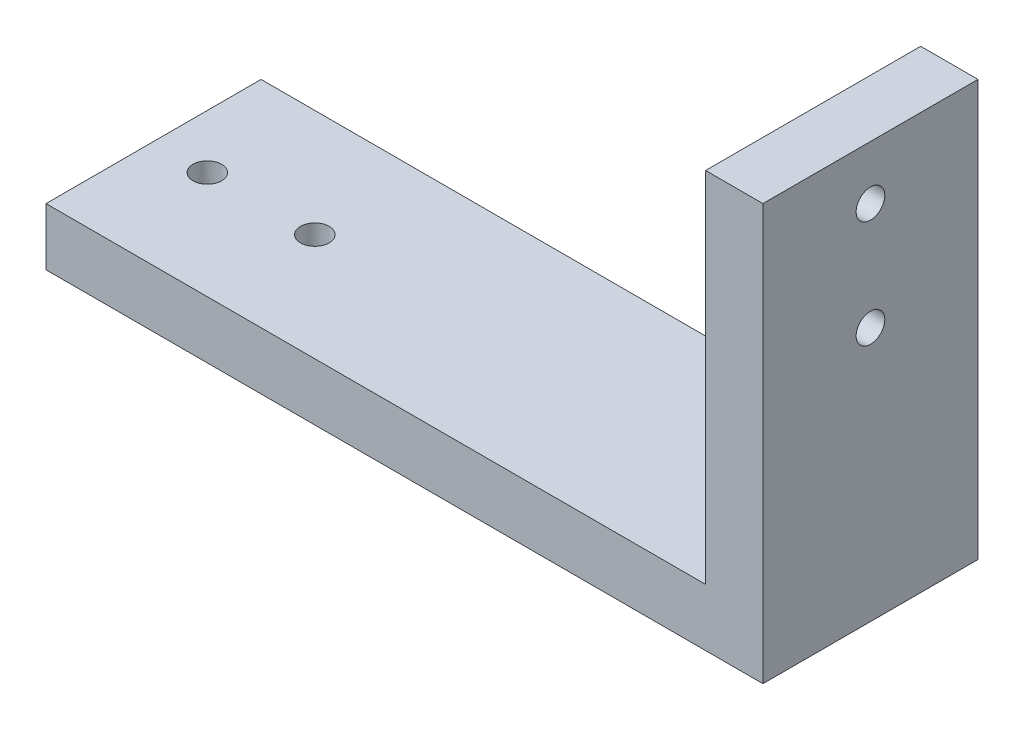
ISO-10303-21;
HEADER;
FILE_DESCRIPTION(('STEP AP214'),'2;1');
FILE_NAME('part.step','',(''),(''),'','','');
FILE_SCHEMA(('AUTOMOTIVE_DESIGN { 1 0 10303 214 1 1 1 1 }'));
ENDSEC;
DATA;
#1=APPLICATION_CONTEXT('core data for automotive mechanical design processes');
#2=APPLICATION_PROTOCOL_DEFINITION('international standard','automotive_design',2000,#1);
#3=PRODUCT_CONTEXT('',#1,'mechanical');
#4=PRODUCT('Part','Part','',(#3));
#5=PRODUCT_RELATED_PRODUCT_CATEGORY('part','',(#4));
#6=PRODUCT_DEFINITION_FORMATION('','',#4);
#7=PRODUCT_DEFINITION_CONTEXT('part definition',#1,'design');
#8=PRODUCT_DEFINITION('design','',#6,#7);
#9=PRODUCT_DEFINITION_SHAPE('','',#8);
#10=(LENGTH_UNIT() NAMED_UNIT(*) SI_UNIT(.MILLI.,.METRE.));
#11=(NAMED_UNIT(*) PLANE_ANGLE_UNIT() SI_UNIT($,.RADIAN.));
#12=(NAMED_UNIT(*) SI_UNIT($,.STERADIAN.) SOLID_ANGLE_UNIT());
#13=UNCERTAINTY_MEASURE_WITH_UNIT(LENGTH_MEASURE(1.E-05),#10,'distance_accuracy_value','');
#14=(GEOMETRIC_REPRESENTATION_CONTEXT(3) GLOBAL_UNCERTAINTY_ASSIGNED_CONTEXT((#13)) GLOBAL_UNIT_ASSIGNED_CONTEXT((#10,
#11,#12)) REPRESENTATION_CONTEXT('',''));
#15=CARTESIAN_POINT('',(0.,0.,0.));
#16=DIRECTION('',(0.,0.,1.));
#17=DIRECTION('',(1.,0.,0.));
#18=AXIS2_PLACEMENT_3D('',#15,#16,#17);
#19=CARTESIAN_POINT('',(0.,8.,0.));
#20=DIRECTION('',(0.,1.,0.));
#21=DIRECTION('',(0.,0.,1.));
#22=AXIS2_PLACEMENT_3D('',#19,#20,#21);
#23=PLANE('',#22);
#24=DIRECTION('',(0.,0.,1.));
#25=VECTOR('',#24,1.);
#26=CARTESIAN_POINT('',(42.,8.,-15.));
#27=LINE('',#26,#25);
#28=CARTESIAN_POINT('',(42.,8.,-15.));
#29=VERTEX_POINT('',#28);
#30=CARTESIAN_POINT('',(42.,8.,15.));
#31=VERTEX_POINT('',#30);
#32=EDGE_CURVE('E50',#29,#31,#27,.T.);
#33=ORIENTED_EDGE('',*,*,#32,.F.);
#34=DIRECTION('',(-1.,0.,0.));
#35=VECTOR('',#34,1.);
#36=CARTESIAN_POINT('',(-50.,8.,-15.));
#37=LINE('',#36,#35);
#38=CARTESIAN_POINT('',(-50.,8.,-15.));
#39=VERTEX_POINT('',#38);
#40=EDGE_CURVE('E87',#29,#39,#37,.T.);
#41=ORIENTED_EDGE('',*,*,#40,.T.);
#42=DIRECTION('',(0.,0.,1.));
#43=VECTOR('',#42,1.);
#44=CARTESIAN_POINT('',(-50.,8.,-15.));
#45=LINE('',#44,#43);
#46=CARTESIAN_POINT('',(-50.,8.,15.));
#47=VERTEX_POINT('',#46);
#48=EDGE_CURVE('E56',#39,#47,#45,.T.);
#49=ORIENTED_EDGE('',*,*,#48,.T.);
#50=DIRECTION('',(1.,0.,0.));
#51=VECTOR('',#50,1.);
#52=CARTESIAN_POINT('',(-50.,8.,15.));
#53=LINE('',#52,#51);
#54=EDGE_CURVE('E97',#47,#31,#53,.T.);
#55=ORIENTED_EDGE('',*,*,#54,.T.);
#56=EDGE_LOOP('',(#33,#41,#49,#55));
#57=FACE_BOUND('',#56,.T.);
#58=CARTESIAN_POINT('',(-42.5,8.,0.));
#59=DIRECTION('',(0.,1.,0.));
#60=DIRECTION('',(0.,0.,1.));
#61=AXIS2_PLACEMENT_3D('',#58,#59,#60);
#62=CIRCLE('',#61,2.);
#63=CARTESIAN_POINT('',(-42.5,8.,2.));
#64=VERTEX_POINT('',#63);
#65=EDGE_CURVE('E102',#64,#64,#62,.T.);
#66=ORIENTED_EDGE('',*,*,#65,.F.);
#67=EDGE_LOOP('',(#66));
#68=FACE_BOUND('',#67,.T.);
#69=CARTESIAN_POINT('',(-27.5,8.,0.));
#70=DIRECTION('',(0.,1.,0.));
#71=DIRECTION('',(0.,0.,1.));
#72=AXIS2_PLACEMENT_3D('',#69,#70,#71);
#73=CIRCLE('',#72,2.);
#74=CARTESIAN_POINT('',(-27.5,8.,2.));
#75=VERTEX_POINT('',#74);
#76=EDGE_CURVE('E145',#75,#75,#73,.T.);
#77=ORIENTED_EDGE('',*,*,#76,.F.);
#78=EDGE_LOOP('',(#77));
#79=FACE_BOUND('',#78,.T.);
#80=ADVANCED_FACE('F33',(#57,#68,#79),#23,.T.);
#81=CARTESIAN_POINT('',(0.,0.,0.));
#82=DIRECTION('',(0.,1.,0.));
#83=DIRECTION('',(0.,0.,1.));
#84=AXIS2_PLACEMENT_3D('',#81,#82,#83);
#85=PLANE('',#84);
#86=DIRECTION('',(0.,0.,-1.));
#87=VECTOR('',#86,1.);
#88=CARTESIAN_POINT('',(50.,0.,-15.));
#89=LINE('',#88,#87);
#90=CARTESIAN_POINT('',(50.,0.,15.));
#91=VERTEX_POINT('',#90);
#92=CARTESIAN_POINT('',(50.,0.,-15.));
#93=VERTEX_POINT('',#92);
#94=EDGE_CURVE('E94',#91,#93,#89,.T.);
#95=ORIENTED_EDGE('',*,*,#94,.F.);
#96=DIRECTION('',(1.,0.,0.));
#97=VECTOR('',#96,1.);
#98=CARTESIAN_POINT('',(-50.,0.,15.));
#99=LINE('',#98,#97);
#100=CARTESIAN_POINT('',(-50.,0.,15.));
#101=VERTEX_POINT('',#100);
#102=EDGE_CURVE('E76',#101,#91,#99,.T.);
#103=ORIENTED_EDGE('',*,*,#102,.F.);
#104=DIRECTION('',(0.,0.,1.));
#105=VECTOR('',#104,1.);
#106=CARTESIAN_POINT('',(-50.,0.,-15.));
#107=LINE('',#106,#105);
#108=CARTESIAN_POINT('',(-50.,0.,-15.));
#109=VERTEX_POINT('',#108);
#110=EDGE_CURVE('E88',#109,#101,#107,.T.);
#111=ORIENTED_EDGE('',*,*,#110,.F.);
#112=DIRECTION('',(-1.,0.,0.));
#113=VECTOR('',#112,1.);
#114=CARTESIAN_POINT('',(-50.,0.,-15.));
#115=LINE('',#114,#113);
#116=EDGE_CURVE('E101',#93,#109,#115,.T.);
#117=ORIENTED_EDGE('',*,*,#116,.F.);
#118=EDGE_LOOP('',(#95,#103,#111,#117));
#119=FACE_BOUND('',#118,.T.);
#120=CARTESIAN_POINT('',(-42.5,0.,0.));
#121=DIRECTION('',(0.,1.,0.));
#122=DIRECTION('',(0.,0.,1.));
#123=AXIS2_PLACEMENT_3D('',#120,#121,#122);
#124=CIRCLE('',#123,2.);
#125=CARTESIAN_POINT('',(-42.5,0.,2.));
#126=VERTEX_POINT('',#125);
#127=EDGE_CURVE('E106',#126,#126,#124,.T.);
#128=ORIENTED_EDGE('',*,*,#127,.T.);
#129=EDGE_LOOP('',(#128));
#130=FACE_BOUND('',#129,.T.);
#131=CARTESIAN_POINT('',(-27.5,0.,0.));
#132=DIRECTION('',(0.,1.,0.));
#133=DIRECTION('',(0.,0.,1.));
#134=AXIS2_PLACEMENT_3D('',#131,#132,#133);
#135=CIRCLE('',#134,2.);
#136=CARTESIAN_POINT('',(-27.5,0.,2.));
#137=VERTEX_POINT('',#136);
#138=EDGE_CURVE('E144',#137,#137,#135,.T.);
#139=ORIENTED_EDGE('',*,*,#138,.T.);
#140=EDGE_LOOP('',(#139));
#141=FACE_BOUND('',#140,.T.);
#142=ADVANCED_FACE('F99',(#119,#130,#141),#85,.F.);
#143=CARTESIAN_POINT('',(50.,8.,-15.));
#144=DIRECTION('',(-1.,0.,0.));
#145=DIRECTION('',(0.,0.,1.));
#146=AXIS2_PLACEMENT_3D('',#143,#144,#145);
#147=PLANE('',#146);
#148=CARTESIAN_POINT('',(50.,50.5,0.));
#149=DIRECTION('',(1.,0.,0.));
#150=DIRECTION('',(0.,0.,-1.));
#151=AXIS2_PLACEMENT_3D('',#148,#149,#150);
#152=CIRCLE('',#151,2.);
#153=CARTESIAN_POINT('',(50.,50.5,-2.));
#154=VERTEX_POINT('',#153);
#155=EDGE_CURVE('E116',#154,#154,#152,.T.);
#156=ORIENTED_EDGE('',*,*,#155,.F.);
#157=EDGE_LOOP('',(#156));
#158=FACE_BOUND('',#157,.T.);
#159=CARTESIAN_POINT('',(50.,35.5,0.));
#160=DIRECTION('',(1.,0.,0.));
#161=DIRECTION('',(0.,0.,-1.));
#162=AXIS2_PLACEMENT_3D('',#159,#160,#161);
#163=CIRCLE('',#162,2.);
#164=CARTESIAN_POINT('',(50.,35.5,-2.));
#165=VERTEX_POINT('',#164);
#166=EDGE_CURVE('E121',#165,#165,#163,.T.);
#167=ORIENTED_EDGE('',*,*,#166,.F.);
#168=EDGE_LOOP('',(#167));
#169=FACE_BOUND('',#168,.T.);
#170=ORIENTED_EDGE('',*,*,#94,.T.);
#171=DIRECTION('',(0.,-1.,0.));
#172=VECTOR('',#171,1.);
#173=CARTESIAN_POINT('',(50.,8.,-15.));
#174=LINE('',#173,#172);
#175=CARTESIAN_POINT('',(50.,58.,-15.));
#176=VERTEX_POINT('',#175);
#177=EDGE_CURVE('E11',#176,#93,#174,.T.);
#178=ORIENTED_EDGE('',*,*,#177,.F.);
#179=DIRECTION('',(0.,0.,-1.));
#180=VECTOR('',#179,1.);
#181=CARTESIAN_POINT('',(50.,58.,-15.));
#182=LINE('',#181,#180);
#183=CARTESIAN_POINT('',(50.,58.,15.));
#184=VERTEX_POINT('',#183);
#185=EDGE_CURVE('E96',#184,#176,#182,.T.);
#186=ORIENTED_EDGE('',*,*,#185,.F.);
#187=DIRECTION('',(0.,-1.,0.));
#188=VECTOR('',#187,1.);
#189=CARTESIAN_POINT('',(50.,8.,15.));
#190=LINE('',#189,#188);
#191=EDGE_CURVE('E80',#184,#91,#190,.T.);
#192=ORIENTED_EDGE('',*,*,#191,.T.);
#193=EDGE_LOOP('',(#170,#178,#186,#192));
#194=FACE_BOUND('',#193,.T.);
#195=ADVANCED_FACE('F35',(#158,#169,#194),#147,.F.);
#196=CARTESIAN_POINT('',(-50.,8.,-15.));
#197=DIRECTION('',(0.,0.,1.));
#198=DIRECTION('',(1.,0.,0.));
#199=AXIS2_PLACEMENT_3D('',#196,#197,#198);
#200=PLANE('',#199);
#201=ORIENTED_EDGE('',*,*,#116,.T.);
#202=DIRECTION('',(0.,-1.,0.));
#203=VECTOR('',#202,1.);
#204=CARTESIAN_POINT('',(-50.,8.,-15.));
#205=LINE('',#204,#203);
#206=EDGE_CURVE('E42',#39,#109,#205,.T.);
#207=ORIENTED_EDGE('',*,*,#206,.F.);
#208=ORIENTED_EDGE('',*,*,#40,.F.);
#209=DIRECTION('',(0.,-1.,0.));
#210=VECTOR('',#209,1.);
#211=CARTESIAN_POINT('',(42.,58.,-15.));
#212=LINE('',#211,#210);
#213=CARTESIAN_POINT('',(42.,58.,-15.));
#214=VERTEX_POINT('',#213);
#215=EDGE_CURVE('E141',#214,#29,#212,.T.);
#216=ORIENTED_EDGE('',*,*,#215,.F.);
#217=DIRECTION('',(-1.,0.,0.));
#218=VECTOR('',#217,1.);
#219=CARTESIAN_POINT('',(50.,58.,-15.));
#220=LINE('',#219,#218);
#221=EDGE_CURVE('E129',#176,#214,#220,.T.);
#222=ORIENTED_EDGE('',*,*,#221,.F.);
#223=ORIENTED_EDGE('',*,*,#177,.T.);
#224=EDGE_LOOP('',(#201,#207,#208,#216,#222,#223));
#225=FACE_BOUND('',#224,.T.);
#226=ADVANCED_FACE('F170',(#225),#200,.F.);
#227=CARTESIAN_POINT('',(-50.,8.,-15.));
#228=DIRECTION('',(1.,0.,0.));
#229=DIRECTION('',(0.,0.,-1.));
#230=AXIS2_PLACEMENT_3D('',#227,#228,#229);
#231=PLANE('',#230);
#232=ORIENTED_EDGE('',*,*,#110,.T.);
#233=DIRECTION('',(0.,-1.,0.));
#234=VECTOR('',#233,1.);
#235=CARTESIAN_POINT('',(-50.,8.,15.));
#236=LINE('',#235,#234);
#237=EDGE_CURVE('E83',#47,#101,#236,.T.);
#238=ORIENTED_EDGE('',*,*,#237,.F.);
#239=ORIENTED_EDGE('',*,*,#48,.F.);
#240=ORIENTED_EDGE('',*,*,#206,.T.);
#241=EDGE_LOOP('',(#232,#238,#239,#240));
#242=FACE_BOUND('',#241,.T.);
#243=ADVANCED_FACE('F173',(#242),#231,.F.);
#244=CARTESIAN_POINT('',(-50.,8.,15.));
#245=DIRECTION('',(0.,0.,-1.));
#246=DIRECTION('',(-1.,0.,0.));
#247=AXIS2_PLACEMENT_3D('',#244,#245,#246);
#248=PLANE('',#247);
#249=ORIENTED_EDGE('',*,*,#102,.T.);
#250=ORIENTED_EDGE('',*,*,#191,.F.);
#251=DIRECTION('',(1.,0.,0.));
#252=VECTOR('',#251,1.);
#253=CARTESIAN_POINT('',(50.,58.,15.));
#254=LINE('',#253,#252);
#255=CARTESIAN_POINT('',(42.,58.,15.));
#256=VERTEX_POINT('',#255);
#257=EDGE_CURVE('E135',#256,#184,#254,.T.);
#258=ORIENTED_EDGE('',*,*,#257,.F.);
#259=DIRECTION('',(0.,-1.,0.));
#260=VECTOR('',#259,1.);
#261=CARTESIAN_POINT('',(42.,58.,15.));
#262=LINE('',#261,#260);
#263=EDGE_CURVE('E137',#256,#31,#262,.T.);
#264=ORIENTED_EDGE('',*,*,#263,.T.);
#265=ORIENTED_EDGE('',*,*,#54,.F.);
#266=ORIENTED_EDGE('',*,*,#237,.T.);
#267=EDGE_LOOP('',(#249,#250,#258,#264,#265,#266));
#268=FACE_BOUND('',#267,.T.);
#269=ADVANCED_FACE('F78',(#268),#248,.F.);
#270=CARTESIAN_POINT('',(-42.5,8.,0.));
#271=DIRECTION('',(0.,-1.,0.));
#272=DIRECTION('',(0.,0.,-1.));
#273=AXIS2_PLACEMENT_3D('',#270,#271,#272);
#274=CYLINDRICAL_SURFACE('',#273,2.);
#275=ORIENTED_EDGE('',*,*,#65,.T.);
#276=EDGE_LOOP('',(#275));
#277=FACE_BOUND('',#276,.T.);
#278=ORIENTED_EDGE('',*,*,#127,.F.);
#279=EDGE_LOOP('',(#278));
#280=FACE_BOUND('',#279,.T.);
#281=ADVANCED_FACE('F180',(#277,#280),#274,.F.);
#282=CARTESIAN_POINT('',(-27.5,8.,0.));
#283=DIRECTION('',(0.,-1.,0.));
#284=DIRECTION('',(0.,0.,-1.));
#285=AXIS2_PLACEMENT_3D('',#282,#283,#284);
#286=CYLINDRICAL_SURFACE('',#285,2.);
#287=ORIENTED_EDGE('',*,*,#76,.T.);
#288=EDGE_LOOP('',(#287));
#289=FACE_BOUND('',#288,.T.);
#290=ORIENTED_EDGE('',*,*,#138,.F.);
#291=EDGE_LOOP('',(#290));
#292=FACE_BOUND('',#291,.T.);
#293=ADVANCED_FACE('F191',(#289,#292),#286,.F.);
#294=CARTESIAN_POINT('',(42.,58.,-15.));
#295=DIRECTION('',(1.,0.,0.));
#296=DIRECTION('',(0.,0.,-1.));
#297=AXIS2_PLACEMENT_3D('',#294,#295,#296);
#298=PLANE('',#297);
#299=CARTESIAN_POINT('',(42.,50.5,0.));
#300=DIRECTION('',(1.,0.,0.));
#301=DIRECTION('',(0.,0.,-1.));
#302=AXIS2_PLACEMENT_3D('',#299,#300,#301);
#303=CIRCLE('',#302,2.);
#304=CARTESIAN_POINT('',(42.,50.5,-2.));
#305=VERTEX_POINT('',#304);
#306=EDGE_CURVE('E37',#305,#305,#303,.T.);
#307=ORIENTED_EDGE('',*,*,#306,.T.);
#308=EDGE_LOOP('',(#307));
#309=FACE_BOUND('',#308,.T.);
#310=CARTESIAN_POINT('',(42.,35.5,0.));
#311=DIRECTION('',(1.,0.,0.));
#312=DIRECTION('',(0.,0.,-1.));
#313=AXIS2_PLACEMENT_3D('',#310,#311,#312);
#314=CIRCLE('',#313,2.);
#315=CARTESIAN_POINT('',(42.,35.5,-2.));
#316=VERTEX_POINT('',#315);
#317=EDGE_CURVE('E114',#316,#316,#314,.T.);
#318=ORIENTED_EDGE('',*,*,#317,.T.);
#319=EDGE_LOOP('',(#318));
#320=FACE_BOUND('',#319,.T.);
#321=ORIENTED_EDGE('',*,*,#32,.T.);
#322=ORIENTED_EDGE('',*,*,#263,.F.);
#323=DIRECTION('',(0.,0.,1.));
#324=VECTOR('',#323,1.);
#325=CARTESIAN_POINT('',(42.,58.,-15.));
#326=LINE('',#325,#324);
#327=EDGE_CURVE('E132',#214,#256,#326,.T.);
#328=ORIENTED_EDGE('',*,*,#327,.F.);
#329=ORIENTED_EDGE('',*,*,#215,.T.);
#330=EDGE_LOOP('',(#321,#322,#328,#329));
#331=FACE_BOUND('',#330,.T.);
#332=ADVANCED_FACE('F157',(#309,#320,#331),#298,.F.);
#333=CARTESIAN_POINT('',(0.,58.,0.));
#334=DIRECTION('',(0.,-1.,0.));
#335=DIRECTION('',(0.,0.,-1.));
#336=AXIS2_PLACEMENT_3D('',#333,#334,#335);
#337=PLANE('',#336);
#338=ORIENTED_EDGE('',*,*,#185,.T.);
#339=ORIENTED_EDGE('',*,*,#221,.T.);
#340=ORIENTED_EDGE('',*,*,#327,.T.);
#341=ORIENTED_EDGE('',*,*,#257,.T.);
#342=EDGE_LOOP('',(#338,#339,#340,#341));
#343=FACE_BOUND('',#342,.T.);
#344=ADVANCED_FACE('F164',(#343),#337,.F.);
#345=CARTESIAN_POINT('',(0.,35.5,0.));
#346=DIRECTION('',(1.,0.,0.));
#347=DIRECTION('',(0.,0.,-1.));
#348=AXIS2_PLACEMENT_3D('',#345,#346,#347);
#349=CYLINDRICAL_SURFACE('',#348,2.);
#350=ORIENTED_EDGE('',*,*,#166,.T.);
#351=EDGE_LOOP('',(#350));
#352=FACE_BOUND('',#351,.T.);
#353=ORIENTED_EDGE('',*,*,#317,.F.);
#354=EDGE_LOOP('',(#353));
#355=FACE_BOUND('',#354,.T.);
#356=ADVANCED_FACE('F201',(#352,#355),#349,.F.);
#357=CARTESIAN_POINT('',(0.,50.5,0.));
#358=DIRECTION('',(1.,0.,0.));
#359=DIRECTION('',(0.,0.,-1.));
#360=AXIS2_PLACEMENT_3D('',#357,#358,#359);
#361=CYLINDRICAL_SURFACE('',#360,2.);
#362=ORIENTED_EDGE('',*,*,#155,.T.);
#363=EDGE_LOOP('',(#362));
#364=FACE_BOUND('',#363,.T.);
#365=ORIENTED_EDGE('',*,*,#306,.F.);
#366=EDGE_LOOP('',(#365));
#367=FACE_BOUND('',#366,.T.);
#368=ADVANCED_FACE('F204',(#364,#367),#361,.F.);
#369=CLOSED_SHELL('',(#80,#142,#195,#226,#243,#269,#281,#293,#332,#344,#356,#368));
#370=MANIFOLD_SOLID_BREP('B2',#369);
#371=ADVANCED_BREP_SHAPE_REPRESENTATION('',(#18,#370),#14);
#372=SHAPE_DEFINITION_REPRESENTATION(#9,#371);
ENDSEC;
END-ISO-10303-21;
